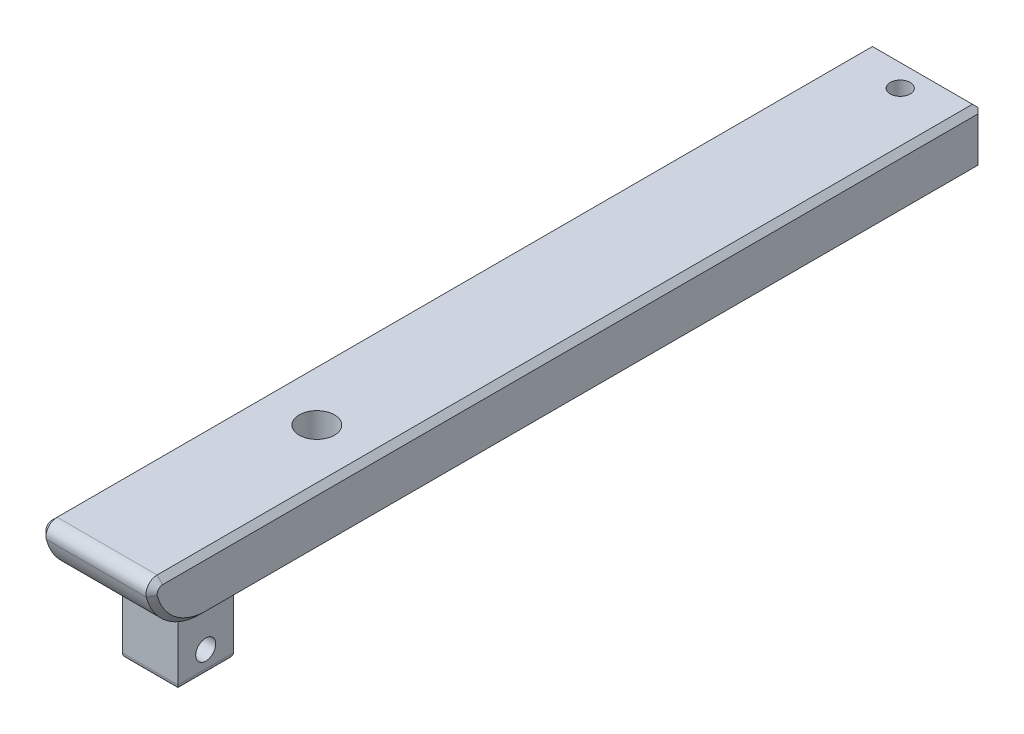
ISO-10303-21;
HEADER;
FILE_DESCRIPTION(('STEP AP214'),'2;1');
FILE_NAME('part.step','',(''),(''),'','','');
FILE_SCHEMA(('AUTOMOTIVE_DESIGN { 1 0 10303 214 1 1 1 1 }'));
ENDSEC;
DATA;
#1=APPLICATION_CONTEXT('core data for automotive mechanical design processes');
#2=APPLICATION_PROTOCOL_DEFINITION('international standard','automotive_design',2000,#1);
#3=PRODUCT_CONTEXT('',#1,'mechanical');
#4=PRODUCT('Part','Part','',(#3));
#5=PRODUCT_RELATED_PRODUCT_CATEGORY('part','',(#4));
#6=PRODUCT_DEFINITION_FORMATION('','',#4);
#7=PRODUCT_DEFINITION_CONTEXT('part definition',#1,'design');
#8=PRODUCT_DEFINITION('design','',#6,#7);
#9=PRODUCT_DEFINITION_SHAPE('','',#8);
#10=(LENGTH_UNIT() NAMED_UNIT(*) SI_UNIT(.MILLI.,.METRE.));
#11=(NAMED_UNIT(*) PLANE_ANGLE_UNIT() SI_UNIT($,.RADIAN.));
#12=(NAMED_UNIT(*) SI_UNIT($,.STERADIAN.) SOLID_ANGLE_UNIT());
#13=UNCERTAINTY_MEASURE_WITH_UNIT(LENGTH_MEASURE(1.E-05),#10,'distance_accuracy_value','');
#14=(GEOMETRIC_REPRESENTATION_CONTEXT(3) GLOBAL_UNCERTAINTY_ASSIGNED_CONTEXT((#13)) GLOBAL_UNIT_ASSIGNED_CONTEXT((#10,
#11,#12)) REPRESENTATION_CONTEXT('',''));
#15=CARTESIAN_POINT('',(0.,0.,0.));
#16=DIRECTION('',(0.,0.,1.));
#17=DIRECTION('',(1.,0.,0.));
#18=AXIS2_PLACEMENT_3D('',#15,#16,#17);
#19=CARTESIAN_POINT('',(0.,0.,0.));
#20=DIRECTION('',(0.,-1.,0.));
#21=DIRECTION('',(0.,0.,-1.));
#22=AXIS2_PLACEMENT_3D('',#19,#20,#21);
#23=PLANE('',#22);
#24=CARTESIAN_POINT('',(10.,0.,-40.));
#25=DIRECTION('',(0.,-1.,0.));
#26=DIRECTION('',(0.,0.,-1.));
#27=AXIS2_PLACEMENT_3D('',#24,#25,#26);
#28=CIRCLE('',#27,3.175);
#29=CARTESIAN_POINT('',(10.,0.,-43.175));
#30=VERTEX_POINT('',#29);
#31=EDGE_CURVE('E290',#30,#30,#28,.T.);
#32=ORIENTED_EDGE('',*,*,#31,.F.);
#33=EDGE_LOOP('',(#32));
#34=FACE_BOUND('',#33,.T.);
#35=CARTESIAN_POINT('',(10.,0.,-145.));
#36=DIRECTION('',(0.,-1.,0.));
#37=DIRECTION('',(0.,0.,-1.));
#38=AXIS2_PLACEMENT_3D('',#35,#36,#37);
#39=CIRCLE('',#38,1.8);
#40=CARTESIAN_POINT('',(10.,0.,-146.8));
#41=VERTEX_POINT('',#40);
#42=EDGE_CURVE('E188',#41,#41,#39,.T.);
#43=ORIENTED_EDGE('',*,*,#42,.F.);
#44=EDGE_LOOP('',(#43));
#45=FACE_BOUND('',#44,.T.);
#46=DIRECTION('',(0.,0.,-1.));
#47=VECTOR('',#46,1.);
#48=CARTESIAN_POINT('',(0.99999999999998,0.,-150.));
#49=LINE('',#48,#47);
#50=CARTESIAN_POINT('',(0.99999999999998,0.,-10.));
#51=VERTEX_POINT('',#50);
#52=CARTESIAN_POINT('',(0.99999999999998,0.,-149.));
#53=VERTEX_POINT('',#52);
#54=EDGE_CURVE('E246',#51,#53,#49,.T.);
#55=ORIENTED_EDGE('',*,*,#54,.T.);
#56=DIRECTION('',(1.,0.,0.));
#57=VECTOR('',#56,1.);
#58=CARTESIAN_POINT('',(19.,0.,-149.));
#59=LINE('',#58,#57);
#60=CARTESIAN_POINT('',(19.,0.,-149.));
#61=VERTEX_POINT('',#60);
#62=EDGE_CURVE('E48',#53,#61,#59,.T.);
#63=ORIENTED_EDGE('',*,*,#62,.T.);
#64=DIRECTION('',(0.,0.,1.));
#65=VECTOR('',#64,1.);
#66=CARTESIAN_POINT('',(19.,0.,-10.));
#67=LINE('',#66,#65);
#68=CARTESIAN_POINT('',(19.,0.,-10.));
#69=VERTEX_POINT('',#68);
#70=EDGE_CURVE('E248',#61,#69,#67,.T.);
#71=ORIENTED_EDGE('',*,*,#70,.T.);
#72=DIRECTION('',(1.,0.,0.));
#73=VECTOR('',#72,1.);
#74=CARTESIAN_POINT('',(0.,0.,-10.));
#75=LINE('',#74,#73);
#76=CARTESIAN_POINT('',(15.,0.,-10.));
#77=VERTEX_POINT('',#76);
#78=EDGE_CURVE('E221',#69,#77,#75,.F.);
#79=ORIENTED_EDGE('',*,*,#78,.T.);
#80=DIRECTION('',(0.,0.,1.));
#81=VECTOR('',#80,1.);
#82=CARTESIAN_POINT('',(15.,0.,-10.));
#83=LINE('',#82,#81);
#84=CARTESIAN_POINT('',(15.,0.,-20.));
#85=VERTEX_POINT('',#84);
#86=EDGE_CURVE('E203',#85,#77,#83,.T.);
#87=ORIENTED_EDGE('',*,*,#86,.F.);
#88=DIRECTION('',(1.,0.,0.));
#89=VECTOR('',#88,1.);
#90=CARTESIAN_POINT('',(5.,0.,-20.));
#91=LINE('',#90,#89);
#92=CARTESIAN_POINT('',(5.,0.,-20.));
#93=VERTEX_POINT('',#92);
#94=EDGE_CURVE('E183',#93,#85,#91,.T.);
#95=ORIENTED_EDGE('',*,*,#94,.F.);
#96=DIRECTION('',(0.,0.,-1.));
#97=VECTOR('',#96,1.);
#98=CARTESIAN_POINT('',(5.,0.,-10.));
#99=LINE('',#98,#97);
#100=CARTESIAN_POINT('',(5.,0.,-10.));
#101=VERTEX_POINT('',#100);
#102=EDGE_CURVE('E192',#101,#93,#99,.T.);
#103=ORIENTED_EDGE('',*,*,#102,.F.);
#104=DIRECTION('',(1.,0.,0.));
#105=VECTOR('',#104,1.);
#106=CARTESIAN_POINT('',(0.,0.,-10.));
#107=LINE('',#106,#105);
#108=EDGE_CURVE('E219',#101,#51,#107,.F.);
#109=ORIENTED_EDGE('',*,*,#108,.T.);
#110=EDGE_LOOP('',(#55,#63,#71,#79,#87,#95,#103,#109));
#111=FACE_BOUND('',#110,.T.);
#112=ADVANCED_FACE('F39',(#34,#45,#111),#23,.T.);
#113=CARTESIAN_POINT('',(0.,10.,0.));
#114=DIRECTION('',(1.,0.,0.));
#115=DIRECTION('',(0.,0.,-1.));
#116=AXIS2_PLACEMENT_3D('',#113,#114,#115);
#117=PLANE('',#116);
#118=DIRECTION('',(0.,-1.,0.));
#119=VECTOR('',#118,1.);
#120=CARTESIAN_POINT('',(0.,10.,-149.));
#121=LINE('',#120,#119);
#122=CARTESIAN_POINT('',(0.,9.00000000000001,-149.));
#123=VERTEX_POINT('',#122);
#124=CARTESIAN_POINT('',(0.,0.99999999999999,-149.));
#125=VERTEX_POINT('',#124);
#126=EDGE_CURVE('E269',#123,#125,#121,.T.);
#127=ORIENTED_EDGE('',*,*,#126,.T.);
#128=DIRECTION('',(0.,0.,1.));
#129=VECTOR('',#128,1.);
#130=CARTESIAN_POINT('',(0.,0.99999999999999,-10.));
#131=LINE('',#130,#129);
#132=CARTESIAN_POINT('',(0.,0.99999999999999,-10.));
#133=VERTEX_POINT('',#132);
#134=EDGE_CURVE('E271',#125,#133,#131,.T.);
#135=ORIENTED_EDGE('',*,*,#134,.T.);
#136=CARTESIAN_POINT('',(0.,10.,-10.));
#137=DIRECTION('',(1.,0.,0.));
#138=DIRECTION('',(0.,0.,-1.));
#139=AXIS2_PLACEMENT_3D('',#136,#137,#138);
#140=CIRCLE('',#139,9.00000000000001);
#141=CARTESIAN_POINT('',(0.,7.75,-1.2857874710333));
#142=VERTEX_POINT('',#141);
#143=EDGE_CURVE('E263',#133,#142,#140,.F.);
#144=ORIENTED_EDGE('',*,*,#143,.T.);
#145=CARTESIAN_POINT('',(0.,8.,-2.25403330758517));
#146=DIRECTION('',(1.,0.,0.));
#147=DIRECTION('',(0.,0.,-1.));
#148=AXIS2_PLACEMENT_3D('',#145,#146,#147);
#149=CIRCLE('',#148,1.00000000000001);
#150=CARTESIAN_POINT('',(0.,9.00000000000001,-2.25403330758517));
#151=VERTEX_POINT('',#150);
#152=EDGE_CURVE('E265',#142,#151,#149,.F.);
#153=ORIENTED_EDGE('',*,*,#152,.T.);
#154=DIRECTION('',(0.,0.,-1.));
#155=VECTOR('',#154,1.);
#156=CARTESIAN_POINT('',(0.,9.00000000000001,0.));
#157=LINE('',#156,#155);
#158=EDGE_CURVE('E267',#151,#123,#157,.T.);
#159=ORIENTED_EDGE('',*,*,#158,.T.);
#160=EDGE_LOOP('',(#127,#135,#144,#153,#159));
#161=FACE_BOUND('',#160,.T.);
#162=ADVANCED_FACE('F377',(#161),#117,.F.);
#163=CARTESIAN_POINT('',(20.,10.,0.));
#164=DIRECTION('',(-1.,0.,0.));
#165=DIRECTION('',(0.,0.,1.));
#166=AXIS2_PLACEMENT_3D('',#163,#164,#165);
#167=PLANE('',#166);
#168=DIRECTION('',(0.,0.,-1.));
#169=VECTOR('',#168,1.);
#170=CARTESIAN_POINT('',(20.,1.00000000000001,-150.));
#171=LINE('',#170,#169);
#172=CARTESIAN_POINT('',(20.,1.00000000000001,-10.));
#173=VERTEX_POINT('',#172);
#174=CARTESIAN_POINT('',(20.,1.00000000000001,-149.));
#175=VERTEX_POINT('',#174);
#176=EDGE_CURVE('E241',#173,#175,#171,.T.);
#177=ORIENTED_EDGE('',*,*,#176,.T.);
#178=DIRECTION('',(0.,1.,0.));
#179=VECTOR('',#178,1.);
#180=CARTESIAN_POINT('',(20.,10.,-149.));
#181=LINE('',#180,#179);
#182=CARTESIAN_POINT('',(20.,8.99999999999999,-149.));
#183=VERTEX_POINT('',#182);
#184=EDGE_CURVE('E243',#175,#183,#181,.T.);
#185=ORIENTED_EDGE('',*,*,#184,.T.);
#186=DIRECTION('',(0.,0.,1.));
#187=VECTOR('',#186,1.);
#188=CARTESIAN_POINT('',(20.,8.99999999999999,0.));
#189=LINE('',#188,#187);
#190=CARTESIAN_POINT('',(20.,8.99999999999999,-2.25403330758517));
#191=VERTEX_POINT('',#190);
#192=EDGE_CURVE('E235',#183,#191,#189,.T.);
#193=ORIENTED_EDGE('',*,*,#192,.T.);
#194=CARTESIAN_POINT('',(20.,8.,-2.25403330758517));
#195=DIRECTION('',(-1.,0.,0.));
#196=DIRECTION('',(0.,0.,1.));
#197=AXIS2_PLACEMENT_3D('',#194,#195,#196);
#198=CIRCLE('',#197,0.999999999999985);
#199=CARTESIAN_POINT('',(20.,7.75,-1.28578747103333));
#200=VERTEX_POINT('',#199);
#201=EDGE_CURVE('E237',#191,#200,#198,.F.);
#202=ORIENTED_EDGE('',*,*,#201,.T.);
#203=CARTESIAN_POINT('',(20.,10.,-10.));
#204=DIRECTION('',(-1.,0.,0.));
#205=DIRECTION('',(0.,0.,1.));
#206=AXIS2_PLACEMENT_3D('',#203,#204,#205);
#207=CIRCLE('',#206,8.99999999999999);
#208=EDGE_CURVE('E239',#200,#173,#207,.F.);
#209=ORIENTED_EDGE('',*,*,#208,.T.);
#210=EDGE_LOOP('',(#177,#185,#193,#202,#209));
#211=FACE_BOUND('',#210,.T.);
#212=ADVANCED_FACE('F405',(#211),#167,.F.);
#213=CARTESIAN_POINT('',(0.,10.,-150.));
#214=DIRECTION('',(0.,0.,1.));
#215=DIRECTION('',(1.,0.,0.));
#216=AXIS2_PLACEMENT_3D('',#213,#214,#215);
#217=PLANE('',#216);
#218=DIRECTION('',(0.,1.,0.));
#219=VECTOR('',#218,1.);
#220=CARTESIAN_POINT('',(0.99999999999998,10.,-150.));
#221=LINE('',#220,#219);
#222=CARTESIAN_POINT('',(0.99999999999998,0.999999999999987,-150.));
#223=VERTEX_POINT('',#222);
#224=CARTESIAN_POINT('',(0.99999999999998,9.00000000000003,-150.));
#225=VERTEX_POINT('',#224);
#226=EDGE_CURVE('E229',#223,#225,#221,.T.);
#227=ORIENTED_EDGE('',*,*,#226,.T.);
#228=DIRECTION('',(1.,0.,0.));
#229=VECTOR('',#228,1.);
#230=CARTESIAN_POINT('',(0.,9.00000000000003,-150.));
#231=LINE('',#230,#229);
#232=CARTESIAN_POINT('',(19.,9.00000000000003,-150.));
#233=VERTEX_POINT('',#232);
#234=EDGE_CURVE('E340',#225,#233,#231,.T.);
#235=ORIENTED_EDGE('',*,*,#234,.T.);
#236=DIRECTION('',(0.,-1.,0.));
#237=VECTOR('',#236,1.);
#238=CARTESIAN_POINT('',(19.,10.,-150.));
#239=LINE('',#238,#237);
#240=CARTESIAN_POINT('',(19.,0.999999999999987,-150.));
#241=VERTEX_POINT('',#240);
#242=EDGE_CURVE('E232',#233,#241,#239,.T.);
#243=ORIENTED_EDGE('',*,*,#242,.T.);
#244=DIRECTION('',(-1.,0.,0.));
#245=VECTOR('',#244,1.);
#246=CARTESIAN_POINT('',(0.99999999999998,0.999999999999987,-150.));
#247=LINE('',#246,#245);
#248=EDGE_CURVE('E337',#241,#223,#247,.T.);
#249=ORIENTED_EDGE('',*,*,#248,.T.);
#250=EDGE_LOOP('',(#227,#235,#243,#249));
#251=FACE_BOUND('',#250,.T.);
#252=ADVANCED_FACE('F435',(#251),#217,.F.);
#253=CARTESIAN_POINT('',(0.,10.,0.));
#254=DIRECTION('',(0.,-1.,0.));
#255=DIRECTION('',(0.,0.,-1.));
#256=AXIS2_PLACEMENT_3D('',#253,#254,#255);
#257=PLANE('',#256);
#258=CARTESIAN_POINT('',(10.,10.,-40.));
#259=DIRECTION('',(0.,-1.,0.));
#260=DIRECTION('',(0.,0.,-1.));
#261=AXIS2_PLACEMENT_3D('',#258,#259,#260);
#262=CIRCLE('',#261,3.175);
#263=CARTESIAN_POINT('',(10.,10.,-43.175));
#264=VERTEX_POINT('',#263);
#265=EDGE_CURVE('E709',#264,#264,#262,.T.);
#266=ORIENTED_EDGE('',*,*,#265,.T.);
#267=EDGE_LOOP('',(#266));
#268=FACE_BOUND('',#267,.T.);
#269=CARTESIAN_POINT('',(10.,10.,-145.));
#270=DIRECTION('',(0.,-1.,0.));
#271=DIRECTION('',(0.,0.,-1.));
#272=AXIS2_PLACEMENT_3D('',#269,#270,#271);
#273=CIRCLE('',#272,1.8);
#274=CARTESIAN_POINT('',(10.,10.,-146.8));
#275=VERTEX_POINT('',#274);
#276=EDGE_CURVE('E216',#275,#275,#273,.T.);
#277=ORIENTED_EDGE('',*,*,#276,.T.);
#278=EDGE_LOOP('',(#277));
#279=FACE_BOUND('',#278,.T.);
#280=DIRECTION('',(0.,0.,-1.));
#281=VECTOR('',#280,1.);
#282=CARTESIAN_POINT('',(19.,10.,0.));
#283=LINE('',#282,#281);
#284=CARTESIAN_POINT('',(19.,10.,-2.25403330758517));
#285=VERTEX_POINT('',#284);
#286=CARTESIAN_POINT('',(19.,10.,-149.));
#287=VERTEX_POINT('',#286);
#288=EDGE_CURVE('E260',#285,#287,#283,.T.);
#289=ORIENTED_EDGE('',*,*,#288,.T.);
#290=DIRECTION('',(-1.,0.,0.));
#291=VECTOR('',#290,1.);
#292=CARTESIAN_POINT('',(0.,10.,-149.));
#293=LINE('',#292,#291);
#294=CARTESIAN_POINT('',(0.99999999999998,10.,-149.));
#295=VERTEX_POINT('',#294);
#296=EDGE_CURVE('E319',#287,#295,#293,.T.);
#297=ORIENTED_EDGE('',*,*,#296,.T.);
#298=DIRECTION('',(0.,0.,1.));
#299=VECTOR('',#298,1.);
#300=CARTESIAN_POINT('',(0.99999999999998,10.,0.));
#301=LINE('',#300,#299);
#302=CARTESIAN_POINT('',(0.99999999999998,10.,-2.25403330758517));
#303=VERTEX_POINT('',#302);
#304=EDGE_CURVE('E258',#295,#303,#301,.T.);
#305=ORIENTED_EDGE('',*,*,#304,.T.);
#306=DIRECTION('',(1.,0.,0.));
#307=VECTOR('',#306,1.);
#308=CARTESIAN_POINT('',(20.,10.,-2.25403330758517));
#309=LINE('',#308,#307);
#310=EDGE_CURVE('E223',#303,#285,#309,.T.);
#311=ORIENTED_EDGE('',*,*,#310,.T.);
#312=EDGE_LOOP('',(#289,#297,#305,#311));
#313=FACE_BOUND('',#312,.T.);
#314=ADVANCED_FACE('F358',(#268,#279,#313),#257,.F.);
#315=CARTESIAN_POINT('',(10.,0.,-145.));
#316=DIRECTION('',(0.,-1.,0.));
#317=DIRECTION('',(0.,0.,-1.));
#318=AXIS2_PLACEMENT_3D('',#315,#316,#317);
#319=CYLINDRICAL_SURFACE('',#318,1.8);
#320=ORIENTED_EDGE('',*,*,#276,.F.);
#321=EDGE_LOOP('',(#320));
#322=FACE_BOUND('',#321,.T.);
#323=ORIENTED_EDGE('',*,*,#42,.T.);
#324=EDGE_LOOP('',(#323));
#325=FACE_BOUND('',#324,.T.);
#326=ADVANCED_FACE('F660',(#322,#325),#319,.F.);
#327=CARTESIAN_POINT('',(5.,-14.,-10.));
#328=DIRECTION('',(1.,0.,0.));
#329=DIRECTION('',(0.,0.,-1.));
#330=AXIS2_PLACEMENT_3D('',#327,#328,#329);
#331=PLANE('',#330);
#332=CARTESIAN_POINT('',(5.,-10.,-15.));
#333=DIRECTION('',(-1.,0.,0.));
#334=DIRECTION('',(0.,0.,1.));
#335=AXIS2_PLACEMENT_3D('',#332,#333,#334);
#336=CIRCLE('',#335,1.79999999999999);
#337=CARTESIAN_POINT('',(5.,-10.,-13.2));
#338=VERTEX_POINT('',#337);
#339=EDGE_CURVE('E713',#338,#338,#336,.T.);
#340=ORIENTED_EDGE('',*,*,#339,.F.);
#341=EDGE_LOOP('',(#340));
#342=FACE_BOUND('',#341,.T.);
#343=DIRECTION('',(0.,1.,0.));
#344=VECTOR('',#343,1.);
#345=CARTESIAN_POINT('',(5.,-14.,-20.));
#346=LINE('',#345,#344);
#347=CARTESIAN_POINT('',(5.,-13.,-20.));
#348=VERTEX_POINT('',#347);
#349=EDGE_CURVE('E178',#348,#93,#346,.T.);
#350=ORIENTED_EDGE('',*,*,#349,.F.);
#351=DIRECTION('',(0.,0.,-1.));
#352=VECTOR('',#351,1.);
#353=CARTESIAN_POINT('',(5.,-13.,-10.));
#354=LINE('',#353,#352);
#355=CARTESIAN_POINT('',(5.,-13.,-10.));
#356=VERTEX_POINT('',#355);
#357=EDGE_CURVE('E313',#348,#356,#354,.F.);
#358=ORIENTED_EDGE('',*,*,#357,.T.);
#359=DIRECTION('',(0.,1.,0.));
#360=VECTOR('',#359,1.);
#361=CARTESIAN_POINT('',(5.,-14.,-10.));
#362=LINE('',#361,#360);
#363=EDGE_CURVE('E195',#356,#101,#362,.T.);
#364=ORIENTED_EDGE('',*,*,#363,.T.);
#365=ORIENTED_EDGE('',*,*,#102,.T.);
#366=EDGE_LOOP('',(#350,#358,#364,#365));
#367=FACE_BOUND('',#366,.T.);
#368=ADVANCED_FACE('F193',(#342,#367),#331,.F.);
#369=CARTESIAN_POINT('',(5.,-14.,-20.));
#370=DIRECTION('',(0.,0.,1.));
#371=DIRECTION('',(1.,0.,0.));
#372=AXIS2_PLACEMENT_3D('',#369,#370,#371);
#373=PLANE('',#372);
#374=DIRECTION('',(0.,1.,0.));
#375=VECTOR('',#374,1.);
#376=CARTESIAN_POINT('',(15.,-14.,-20.));
#377=LINE('',#376,#375);
#378=CARTESIAN_POINT('',(15.,-13.,-20.));
#379=VERTEX_POINT('',#378);
#380=EDGE_CURVE('E189',#379,#85,#377,.T.);
#381=ORIENTED_EDGE('',*,*,#380,.F.);
#382=DIRECTION('',(1.,0.,0.));
#383=VECTOR('',#382,1.);
#384=CARTESIAN_POINT('',(5.,-13.,-20.));
#385=LINE('',#384,#383);
#386=EDGE_CURVE('E186',#379,#348,#385,.F.);
#387=ORIENTED_EDGE('',*,*,#386,.T.);
#388=ORIENTED_EDGE('',*,*,#349,.T.);
#389=ORIENTED_EDGE('',*,*,#94,.T.);
#390=EDGE_LOOP('',(#381,#387,#388,#389));
#391=FACE_BOUND('',#390,.T.);
#392=ADVANCED_FACE('F181',(#391),#373,.F.);
#393=CARTESIAN_POINT('',(15.,-14.,-10.));
#394=DIRECTION('',(-1.,0.,0.));
#395=DIRECTION('',(0.,0.,1.));
#396=AXIS2_PLACEMENT_3D('',#393,#394,#395);
#397=PLANE('',#396);
#398=CARTESIAN_POINT('',(15.,-10.,-15.));
#399=DIRECTION('',(-1.,0.,0.));
#400=DIRECTION('',(0.,0.,1.));
#401=AXIS2_PLACEMENT_3D('',#398,#399,#400);
#402=CIRCLE('',#401,1.79999999999999);
#403=CARTESIAN_POINT('',(15.,-10.,-13.2));
#404=VERTEX_POINT('',#403);
#405=EDGE_CURVE('E199',#404,#404,#402,.T.);
#406=ORIENTED_EDGE('',*,*,#405,.T.);
#407=EDGE_LOOP('',(#406));
#408=FACE_BOUND('',#407,.T.);
#409=DIRECTION('',(0.,1.,0.));
#410=VECTOR('',#409,1.);
#411=CARTESIAN_POINT('',(15.,-14.,-10.));
#412=LINE('',#411,#410);
#413=CARTESIAN_POINT('',(15.,-13.,-10.));
#414=VERTEX_POINT('',#413);
#415=EDGE_CURVE('E211',#414,#77,#412,.T.);
#416=ORIENTED_EDGE('',*,*,#415,.F.);
#417=DIRECTION('',(0.,0.,1.));
#418=VECTOR('',#417,1.);
#419=CARTESIAN_POINT('',(15.,-13.,-20.));
#420=LINE('',#419,#418);
#421=EDGE_CURVE('E317',#414,#379,#420,.F.);
#422=ORIENTED_EDGE('',*,*,#421,.T.);
#423=ORIENTED_EDGE('',*,*,#380,.T.);
#424=ORIENTED_EDGE('',*,*,#86,.T.);
#425=EDGE_LOOP('',(#416,#422,#423,#424));
#426=FACE_BOUND('',#425,.T.);
#427=ADVANCED_FACE('F637',(#408,#426),#397,.F.);
#428=CARTESIAN_POINT('',(5.,-14.,-10.));
#429=DIRECTION('',(0.,0.,-1.));
#430=DIRECTION('',(-1.,0.,0.));
#431=AXIS2_PLACEMENT_3D('',#428,#429,#430);
#432=PLANE('',#431);
#433=ORIENTED_EDGE('',*,*,#363,.F.);
#434=DIRECTION('',(-1.,0.,0.));
#435=VECTOR('',#434,1.);
#436=CARTESIAN_POINT('',(15.,-13.,-10.));
#437=LINE('',#436,#435);
#438=EDGE_CURVE('E315',#356,#414,#437,.F.);
#439=ORIENTED_EDGE('',*,*,#438,.T.);
#440=ORIENTED_EDGE('',*,*,#415,.T.);
#441=DIRECTION('',(-1.,0.,0.));
#442=VECTOR('',#441,1.);
#443=CARTESIAN_POINT('',(5.,0.,-10.));
#444=LINE('',#443,#442);
#445=EDGE_CURVE('E205',#77,#101,#444,.T.);
#446=ORIENTED_EDGE('',*,*,#445,.T.);
#447=EDGE_LOOP('',(#433,#439,#440,#446));
#448=FACE_BOUND('',#447,.T.);
#449=ADVANCED_FACE('F628',(#448),#432,.F.);
#450=CARTESIAN_POINT('',(0.,-14.,0.));
#451=DIRECTION('',(0.,-1.,0.));
#452=DIRECTION('',(0.,0.,-1.));
#453=AXIS2_PLACEMENT_3D('',#450,#451,#452);
#454=PLANE('',#453);
#455=DIRECTION('',(0.,0.,-1.));
#456=VECTOR('',#455,1.);
#457=CARTESIAN_POINT('',(6.,-14.,-20.));
#458=LINE('',#457,#456);
#459=CARTESIAN_POINT('',(6.,-14.,-11.));
#460=VERTEX_POINT('',#459);
#461=CARTESIAN_POINT('',(6.,-14.,-19.));
#462=VERTEX_POINT('',#461);
#463=EDGE_CURVE('E307',#460,#462,#458,.T.);
#464=ORIENTED_EDGE('',*,*,#463,.T.);
#465=DIRECTION('',(1.,0.,0.));
#466=VECTOR('',#465,1.);
#467=CARTESIAN_POINT('',(15.,-14.,-19.));
#468=LINE('',#467,#466);
#469=CARTESIAN_POINT('',(14.,-14.,-19.));
#470=VERTEX_POINT('',#469);
#471=EDGE_CURVE('E309',#462,#470,#468,.T.);
#472=ORIENTED_EDGE('',*,*,#471,.T.);
#473=DIRECTION('',(0.,0.,1.));
#474=VECTOR('',#473,1.);
#475=CARTESIAN_POINT('',(14.,-14.,-10.));
#476=LINE('',#475,#474);
#477=CARTESIAN_POINT('',(14.,-14.,-11.));
#478=VERTEX_POINT('',#477);
#479=EDGE_CURVE('E274',#470,#478,#476,.T.);
#480=ORIENTED_EDGE('',*,*,#479,.T.);
#481=DIRECTION('',(-1.,0.,0.));
#482=VECTOR('',#481,1.);
#483=CARTESIAN_POINT('',(5.,-14.,-11.));
#484=LINE('',#483,#482);
#485=EDGE_CURVE('E305',#478,#460,#484,.T.);
#486=ORIENTED_EDGE('',*,*,#485,.T.);
#487=EDGE_LOOP('',(#464,#472,#480,#486));
#488=FACE_BOUND('',#487,.T.);
#489=ADVANCED_FACE('F619',(#488),#454,.T.);
#490=CARTESIAN_POINT('',(5.,-10.,-15.));
#491=DIRECTION('',(-1.,0.,0.));
#492=DIRECTION('',(0.,0.,1.));
#493=AXIS2_PLACEMENT_3D('',#490,#491,#492);
#494=CYLINDRICAL_SURFACE('',#493,1.79999999999999);
#495=ORIENTED_EDGE('',*,*,#339,.T.);
#496=EDGE_LOOP('',(#495));
#497=FACE_BOUND('',#496,.T.);
#498=ORIENTED_EDGE('',*,*,#405,.F.);
#499=EDGE_LOOP('',(#498));
#500=FACE_BOUND('',#499,.T.);
#501=ADVANCED_FACE('F609',(#497,#500),#494,.F.);
#502=CARTESIAN_POINT('',(10.,0.,-40.));
#503=DIRECTION('',(0.,-1.,0.));
#504=DIRECTION('',(0.,0.,-1.));
#505=AXIS2_PLACEMENT_3D('',#502,#503,#504);
#506=CYLINDRICAL_SURFACE('',#505,3.175);
#507=ORIENTED_EDGE('',*,*,#265,.F.);
#508=EDGE_LOOP('',(#507));
#509=FACE_BOUND('',#508,.T.);
#510=ORIENTED_EDGE('',*,*,#31,.T.);
#511=EDGE_LOOP('',(#510));
#512=FACE_BOUND('',#511,.T.);
#513=ADVANCED_FACE('F442',(#509,#512),#506,.F.);
#514=CARTESIAN_POINT('',(0.,10.,-10.));
#515=DIRECTION('',(-1.,0.,0.));
#516=DIRECTION('',(0.,0.,1.));
#517=AXIS2_PLACEMENT_3D('',#514,#515,#516);
#518=CYLINDRICAL_SURFACE('',#517,10.);
#519=ORIENTED_EDGE('',*,*,#78,.F.);
#520=CARTESIAN_POINT('',(19.,10.,-10.));
#521=DIRECTION('',(-1.,0.,0.));
#522=DIRECTION('',(0.,0.,1.));
#523=AXIS2_PLACEMENT_3D('',#520,#521,#522);
#524=CIRCLE('',#523,10.);
#525=CARTESIAN_POINT('',(19.,7.5,-0.317541634481458));
#526=VERTEX_POINT('',#525);
#527=EDGE_CURVE('E252',#69,#526,#524,.T.);
#528=ORIENTED_EDGE('',*,*,#527,.T.);
#529=DIRECTION('',(-1.,0.,0.));
#530=VECTOR('',#529,1.);
#531=CARTESIAN_POINT('',(0.,7.5,-0.317541634481458));
#532=LINE('',#531,#530);
#533=CARTESIAN_POINT('',(0.99999999999998,7.5,-0.317541634481458));
#534=VERTEX_POINT('',#533);
#535=EDGE_CURVE('E226',#526,#534,#532,.T.);
#536=ORIENTED_EDGE('',*,*,#535,.T.);
#537=CARTESIAN_POINT('',(0.99999999999998,10.,-10.));
#538=DIRECTION('',(1.,0.,0.));
#539=DIRECTION('',(0.,0.,-1.));
#540=AXIS2_PLACEMENT_3D('',#537,#538,#539);
#541=CIRCLE('',#540,10.);
#542=EDGE_CURVE('E250',#534,#51,#541,.T.);
#543=ORIENTED_EDGE('',*,*,#542,.T.);
#544=ORIENTED_EDGE('',*,*,#108,.F.);
#545=ORIENTED_EDGE('',*,*,#445,.F.);
#546=EDGE_LOOP('',(#519,#528,#536,#543,#544,#545));
#547=FACE_BOUND('',#546,.T.);
#548=ADVANCED_FACE('F390',(#547),#518,.T.);
#549=CARTESIAN_POINT('',(0.,8.,-2.25403330758517));
#550=DIRECTION('',(-1.,0.,0.));
#551=DIRECTION('',(0.,0.,1.));
#552=AXIS2_PLACEMENT_3D('',#549,#550,#551);
#553=CYLINDRICAL_SURFACE('',#552,2.);
#554=ORIENTED_EDGE('',*,*,#535,.F.);
#555=CARTESIAN_POINT('',(19.,8.,-2.25403330758517));
#556=DIRECTION('',(-1.,0.,0.));
#557=DIRECTION('',(0.,0.,1.));
#558=AXIS2_PLACEMENT_3D('',#555,#556,#557);
#559=CIRCLE('',#558,2.);
#560=EDGE_CURVE('E256',#526,#285,#559,.T.);
#561=ORIENTED_EDGE('',*,*,#560,.T.);
#562=ORIENTED_EDGE('',*,*,#310,.F.);
#563=CARTESIAN_POINT('',(0.99999999999998,8.,-2.25403330758517));
#564=DIRECTION('',(1.,0.,0.));
#565=DIRECTION('',(0.,0.,-1.));
#566=AXIS2_PLACEMENT_3D('',#563,#564,#565);
#567=CIRCLE('',#566,2.);
#568=EDGE_CURVE('E254',#303,#534,#567,.T.);
#569=ORIENTED_EDGE('',*,*,#568,.T.);
#570=EDGE_LOOP('',(#554,#561,#562,#569));
#571=FACE_BOUND('',#570,.T.);
#572=ADVANCED_FACE('F386',(#571),#553,.T.);
#573=CARTESIAN_POINT('',(20.,8.,-2.25403330758517));
#574=DIRECTION('',(-1.,0.,0.));
#575=DIRECTION('',(0.,0.,1.));
#576=AXIS2_PLACEMENT_3D('',#573,#574,#575);
#577=CONICAL_SURFACE('',#576,0.999999999999985,0.785398163397448);
#578=DIRECTION('',(0.707106781186547,-0.707106781186547,0.));
#579=VECTOR('',#578,1.);
#580=CARTESIAN_POINT('',(19.,10.,-2.25403330758517));
#581=LINE('',#580,#579);
#582=EDGE_CURVE('E284',#285,#191,#581,.T.);
#583=ORIENTED_EDGE('',*,*,#582,.F.);
#584=ORIENTED_EDGE('',*,*,#560,.F.);
#585=DIRECTION('',(-0.707106781186547,-0.176776695296637,0.684653196881458));
#586=VECTOR('',#585,1.);
#587=CARTESIAN_POINT('',(20.,7.75,-1.28578747103333));
#588=LINE('',#587,#586);
#589=EDGE_CURVE('E287',#200,#526,#588,.T.);
#590=ORIENTED_EDGE('',*,*,#589,.F.);
#591=ORIENTED_EDGE('',*,*,#201,.F.);
#592=EDGE_LOOP('',(#583,#584,#590,#591));
#593=FACE_BOUND('',#592,.T.);
#594=ADVANCED_FACE('F412',(#593),#577,.T.);
#595=CARTESIAN_POINT('',(20.,10.,-10.));
#596=DIRECTION('',(-1.,0.,0.));
#597=DIRECTION('',(0.,0.,1.));
#598=AXIS2_PLACEMENT_3D('',#595,#596,#597);
#599=CONICAL_SURFACE('',#598,8.99999999999999,0.785398163397448);
#600=ORIENTED_EDGE('',*,*,#589,.T.);
#601=ORIENTED_EDGE('',*,*,#527,.F.);
#602=DIRECTION('',(-0.707106781186547,-0.707106781186547,0.));
#603=VECTOR('',#602,1.);
#604=CARTESIAN_POINT('',(20.,1.00000000000001,-10.));
#605=LINE('',#604,#603);
#606=EDGE_CURVE('E281',#173,#69,#605,.T.);
#607=ORIENTED_EDGE('',*,*,#606,.F.);
#608=ORIENTED_EDGE('',*,*,#208,.F.);
#609=EDGE_LOOP('',(#600,#601,#607,#608));
#610=FACE_BOUND('',#609,.T.);
#611=ADVANCED_FACE('F395',(#610),#599,.T.);
#612=CARTESIAN_POINT('',(19.,10.,0.));
#613=DIRECTION('',(-0.707106781186547,-0.707106781186547,0.));
#614=DIRECTION('',(0.,0.,-1.));
#615=AXIS2_PLACEMENT_3D('',#612,#613,#614);
#616=PLANE('',#615);
#617=DIRECTION('',(-0.577350269189623,0.577350269189623,-0.577350269189631));
#618=VECTOR('',#617,1.);
#619=CARTESIAN_POINT('',(69.0000000000002,-40.0000000000002,-99.9999999999991));
#620=LINE('',#619,#618);
#621=CARTESIAN_POINT('',(19.5,9.50000000000001,-149.5));
#622=VERTEX_POINT('',#621);
#623=EDGE_CURVE('E278',#622,#183,#620,.F.);
#624=ORIENTED_EDGE('',*,*,#623,.F.);
#625=DIRECTION('',(-0.577350269189626,0.577350269189626,0.577350269189626));
#626=VECTOR('',#625,1.);
#627=CARTESIAN_POINT('',(-30.6666666666667,59.6666666666667,-99.3333333333333));
#628=LINE('',#627,#626);
#629=EDGE_CURVE('E346',#622,#287,#628,.T.);
#630=ORIENTED_EDGE('',*,*,#629,.T.);
#631=ORIENTED_EDGE('',*,*,#288,.F.);
#632=ORIENTED_EDGE('',*,*,#582,.T.);
#633=ORIENTED_EDGE('',*,*,#192,.F.);
#634=EDGE_LOOP('',(#624,#630,#631,#632,#633));
#635=FACE_BOUND('',#634,.T.);
#636=ADVANCED_FACE('F352',(#635),#616,.F.);
#637=CARTESIAN_POINT('',(20.,1.00000000000001,0.));
#638=DIRECTION('',(0.707106781186547,-0.707106781186547,0.));
#639=DIRECTION('',(0.,0.,1.));
#640=AXIS2_PLACEMENT_3D('',#637,#638,#639);
#641=PLANE('',#640);
#642=ORIENTED_EDGE('',*,*,#70,.F.);
#643=DIRECTION('',(0.577350269189629,0.577350269189629,-0.577350269189621));
#644=VECTOR('',#643,1.);
#645=CARTESIAN_POINT('',(-29.9999999999998,-48.9999999999998,-100.000000000001));
#646=LINE('',#645,#644);
#647=CARTESIAN_POINT('',(19.5,0.500000000000007,-149.5));
#648=VERTEX_POINT('',#647);
#649=EDGE_CURVE('E11',#61,#648,#646,.T.);
#650=ORIENTED_EDGE('',*,*,#649,.T.);
#651=DIRECTION('',(-0.577350269189623,-0.577350269189623,-0.577350269189631));
#652=VECTOR('',#651,1.);
#653=CARTESIAN_POINT('',(69.6666666666669,50.6666666666669,-99.3333333333324));
#654=LINE('',#653,#652);
#655=EDGE_CURVE('E275',#175,#648,#654,.T.);
#656=ORIENTED_EDGE('',*,*,#655,.F.);
#657=ORIENTED_EDGE('',*,*,#176,.F.);
#658=ORIENTED_EDGE('',*,*,#606,.T.);
#659=EDGE_LOOP('',(#642,#650,#656,#657,#658));
#660=FACE_BOUND('',#659,.T.);
#661=ADVANCED_FACE('F400',(#660),#641,.T.);
#662=CARTESIAN_POINT('',(19.,10.,-150.));
#663=DIRECTION('',(-0.707106781186552,0.,0.707106781186543));
#664=DIRECTION('',(0.,-1.,0.));
#665=AXIS2_PLACEMENT_3D('',#662,#663,#664);
#666=PLANE('',#665);
#667=ORIENTED_EDGE('',*,*,#242,.F.);
#668=DIRECTION('',(0.577350269189621,0.577350269189629,0.577350269189629));
#669=VECTOR('',#668,1.);
#670=CARTESIAN_POINT('',(19.3333333333333,9.33333333333336,-149.666666666667));
#671=LINE('',#670,#669);
#672=EDGE_CURVE('E344',#233,#622,#671,.T.);
#673=ORIENTED_EDGE('',*,*,#672,.T.);
#674=ORIENTED_EDGE('',*,*,#623,.T.);
#675=ORIENTED_EDGE('',*,*,#184,.F.);
#676=ORIENTED_EDGE('',*,*,#655,.T.);
#677=DIRECTION('',(0.577350269189618,-0.577350269189634,0.577350269189626));
#678=VECTOR('',#677,1.);
#679=CARTESIAN_POINT('',(16.,4.00000000000007,-153.));
#680=LINE('',#679,#678);
#681=EDGE_CURVE('E342',#648,#241,#680,.F.);
#682=ORIENTED_EDGE('',*,*,#681,.T.);
#683=EDGE_LOOP('',(#667,#673,#674,#675,#676,#682));
#684=FACE_BOUND('',#683,.T.);
#685=ADVANCED_FACE('F408',(#684),#666,.F.);
#686=CARTESIAN_POINT('',(0.99999999999998,10.,0.));
#687=DIRECTION('',(0.707106781186551,-0.707106781186544,0.));
#688=DIRECTION('',(0.,0.,1.));
#689=AXIS2_PLACEMENT_3D('',#686,#687,#688);
#690=PLANE('',#689);
#691=ORIENTED_EDGE('',*,*,#304,.F.);
#692=DIRECTION('',(-0.577350269189622,-0.577350269189628,-0.577350269189628));
#693=VECTOR('',#692,1.);
#694=CARTESIAN_POINT('',(50.6666666666665,59.666666666667,-99.333333333333));
#695=LINE('',#694,#693);
#696=CARTESIAN_POINT('',(0.500000000000007,9.50000000000002,-149.5));
#697=VERTEX_POINT('',#696);
#698=EDGE_CURVE('E331',#295,#697,#695,.T.);
#699=ORIENTED_EDGE('',*,*,#698,.T.);
#700=DIRECTION('',(-0.57735026918962,-0.577350269189626,0.577350269189632));
#701=VECTOR('',#700,1.);
#702=CARTESIAN_POINT('',(-49.,-40.0000000000005,-99.999999999999));
#703=LINE('',#702,#701);
#704=EDGE_CURVE('E299',#123,#697,#703,.F.);
#705=ORIENTED_EDGE('',*,*,#704,.F.);
#706=ORIENTED_EDGE('',*,*,#158,.F.);
#707=DIRECTION('',(-0.707106781186544,-0.707106781186551,0.));
#708=VECTOR('',#707,1.);
#709=CARTESIAN_POINT('',(0.99999999999998,10.,-2.25403330758517));
#710=LINE('',#709,#708);
#711=EDGE_CURVE('E279',#303,#151,#710,.T.);
#712=ORIENTED_EDGE('',*,*,#711,.F.);
#713=EDGE_LOOP('',(#691,#699,#705,#706,#712));
#714=FACE_BOUND('',#713,.T.);
#715=ADVANCED_FACE('F367',(#714),#690,.F.);
#716=CARTESIAN_POINT('',(0.,8.,-2.25403330758517));
#717=DIRECTION('',(1.,0.,0.));
#718=DIRECTION('',(0.,0.,-1.));
#719=AXIS2_PLACEMENT_3D('',#716,#717,#718);
#720=CONICAL_SURFACE('',#719,1.00000000000001,0.785398163397454);
#721=ORIENTED_EDGE('',*,*,#711,.T.);
#722=ORIENTED_EDGE('',*,*,#152,.F.);
#723=DIRECTION('',(-0.707106781186544,0.176776695296638,-0.684653196881461));
#724=VECTOR('',#723,1.);
#725=CARTESIAN_POINT('',(0.99999999999998,7.5,-0.317541634481458));
#726=LINE('',#725,#724);
#727=EDGE_CURVE('E296',#534,#142,#726,.T.);
#728=ORIENTED_EDGE('',*,*,#727,.F.);
#729=ORIENTED_EDGE('',*,*,#568,.F.);
#730=EDGE_LOOP('',(#721,#722,#728,#729));
#731=FACE_BOUND('',#730,.T.);
#732=ADVANCED_FACE('F381',(#731),#720,.T.);
#733=CARTESIAN_POINT('',(0.,10.,-149.));
#734=DIRECTION('',(0.707106781186555,0.,0.70710678118654));
#735=DIRECTION('',(0.,-1.,0.));
#736=AXIS2_PLACEMENT_3D('',#733,#734,#735);
#737=PLANE('',#736);
#738=ORIENTED_EDGE('',*,*,#704,.T.);
#739=DIRECTION('',(0.577350269189618,-0.57735026918963,-0.57735026918963));
#740=VECTOR('',#739,1.);
#741=CARTESIAN_POINT('',(0.,10.,-149.));
#742=LINE('',#741,#740);
#743=EDGE_CURVE('E335',#697,#225,#742,.T.);
#744=ORIENTED_EDGE('',*,*,#743,.T.);
#745=ORIENTED_EDGE('',*,*,#226,.F.);
#746=DIRECTION('',(0.577350269189615,0.577350269189635,-0.577350269189627));
#747=VECTOR('',#746,1.);
#748=CARTESIAN_POINT('',(3.33333333333333,3.33333333333342,-152.333333333333));
#749=LINE('',#748,#747);
#750=CARTESIAN_POINT('',(0.499999999999994,0.499999999999992,-149.5));
#751=VERTEX_POINT('',#750);
#752=EDGE_CURVE('E333',#223,#751,#749,.F.);
#753=ORIENTED_EDGE('',*,*,#752,.T.);
#754=DIRECTION('',(0.57735026918962,-0.577350269189626,-0.577350269189632));
#755=VECTOR('',#754,1.);
#756=CARTESIAN_POINT('',(-2.99999999999997,3.99999999999999,-146.));
#757=LINE('',#756,#755);
#758=EDGE_CURVE('E293',#125,#751,#757,.T.);
#759=ORIENTED_EDGE('',*,*,#758,.F.);
#760=ORIENTED_EDGE('',*,*,#126,.F.);
#761=EDGE_LOOP('',(#738,#744,#745,#753,#759,#760));
#762=FACE_BOUND('',#761,.T.);
#763=ADVANCED_FACE('F372',(#762),#737,.F.);
#764=CARTESIAN_POINT('',(0.,10.,-10.));
#765=DIRECTION('',(1.,0.,0.));
#766=DIRECTION('',(0.,0.,-1.));
#767=AXIS2_PLACEMENT_3D('',#764,#765,#766);
#768=CONICAL_SURFACE('',#767,9.00000000000001,0.785398163397454);
#769=ORIENTED_EDGE('',*,*,#727,.T.);
#770=ORIENTED_EDGE('',*,*,#143,.F.);
#771=DIRECTION('',(-0.707106781186544,0.707106781186551,0.));
#772=VECTOR('',#771,1.);
#773=CARTESIAN_POINT('',(0.99999999999998,0.,-10.));
#774=LINE('',#773,#772);
#775=EDGE_CURVE('E291',#51,#133,#774,.T.);
#776=ORIENTED_EDGE('',*,*,#775,.F.);
#777=ORIENTED_EDGE('',*,*,#542,.F.);
#778=EDGE_LOOP('',(#769,#770,#776,#777));
#779=FACE_BOUND('',#778,.T.);
#780=ADVANCED_FACE('F496',(#779),#768,.T.);
#781=CARTESIAN_POINT('',(0.,0.99999999999999,0.));
#782=DIRECTION('',(-0.707106781186551,-0.707106781186544,0.));
#783=DIRECTION('',(0.,0.,-1.));
#784=AXIS2_PLACEMENT_3D('',#781,#782,#783);
#785=PLANE('',#784);
#786=ORIENTED_EDGE('',*,*,#758,.T.);
#787=DIRECTION('',(0.577350269189624,-0.57735026918963,0.577350269189622));
#788=VECTOR('',#787,1.);
#789=CARTESIAN_POINT('',(49.9999999999996,-49.0000000000001,-100.000000000001));
#790=LINE('',#789,#788);
#791=EDGE_CURVE('E62',#751,#53,#790,.T.);
#792=ORIENTED_EDGE('',*,*,#791,.T.);
#793=ORIENTED_EDGE('',*,*,#54,.F.);
#794=ORIENTED_EDGE('',*,*,#775,.T.);
#795=ORIENTED_EDGE('',*,*,#134,.F.);
#796=EDGE_LOOP('',(#786,#792,#793,#794,#795));
#797=FACE_BOUND('',#796,.T.);
#798=ADVANCED_FACE('F503',(#797),#785,.T.);
#799=CARTESIAN_POINT('',(0.,-13.,-11.));
#800=DIRECTION('',(1.,0.,0.));
#801=DIRECTION('',(0.,0.,-1.));
#802=AXIS2_PLACEMENT_3D('',#799,#800,#801);
#803=CYLINDRICAL_SURFACE('',#802,1.);
#804=CARTESIAN_POINT('',(14.,-13.,-11.));
#805=DIRECTION('',(0.707106781186548,0.,-0.707106781186547));
#806=DIRECTION('',(-0.707106781186547,0.,-0.707106781186548));
#807=AXIS2_PLACEMENT_3D('',#804,#805,#806);
#808=ELLIPSE('',#807,1.41421356237309,1.);
#809=EDGE_CURVE('E324',#414,#478,#808,.T.);
#810=ORIENTED_EDGE('',*,*,#809,.F.);
#811=ORIENTED_EDGE('',*,*,#438,.F.);
#812=CARTESIAN_POINT('',(6.,-13.,-11.));
#813=DIRECTION('',(0.707106781186547,0.,0.707106781186548));
#814=DIRECTION('',(0.707106781186547,0.,-0.707106781186547));
#815=AXIS2_PLACEMENT_3D('',#812,#813,#814);
#816=ELLIPSE('',#815,1.4142135623731,1.);
#817=EDGE_CURVE('E294',#460,#356,#816,.F.);
#818=ORIENTED_EDGE('',*,*,#817,.F.);
#819=ORIENTED_EDGE('',*,*,#485,.F.);
#820=EDGE_LOOP('',(#810,#811,#818,#819));
#821=FACE_BOUND('',#820,.T.);
#822=ADVANCED_FACE('F511',(#821),#803,.T.);
#823=CARTESIAN_POINT('',(6.,-13.,0.));
#824=DIRECTION('',(0.,0.,1.));
#825=DIRECTION('',(1.,0.,0.));
#826=AXIS2_PLACEMENT_3D('',#823,#824,#825);
#827=CYLINDRICAL_SURFACE('',#826,1.);
#828=ORIENTED_EDGE('',*,*,#817,.T.);
#829=ORIENTED_EDGE('',*,*,#357,.F.);
#830=CARTESIAN_POINT('',(6.,-13.,-19.));
#831=DIRECTION('',(-0.707106781186547,0.,0.707106781186547));
#832=DIRECTION('',(0.707106781186547,0.,0.707106781186548));
#833=AXIS2_PLACEMENT_3D('',#830,#831,#832);
#834=ELLIPSE('',#833,1.41421356237309,1.);
#835=EDGE_CURVE('E322',#462,#348,#834,.F.);
#836=ORIENTED_EDGE('',*,*,#835,.F.);
#837=ORIENTED_EDGE('',*,*,#463,.F.);
#838=EDGE_LOOP('',(#828,#829,#836,#837));
#839=FACE_BOUND('',#838,.T.);
#840=ADVANCED_FACE('F518',(#839),#827,.T.);
#841=CARTESIAN_POINT('',(14.,-13.,0.));
#842=DIRECTION('',(0.,0.,-1.));
#843=DIRECTION('',(-1.,0.,0.));
#844=AXIS2_PLACEMENT_3D('',#841,#842,#843);
#845=CYLINDRICAL_SURFACE('',#844,1.);
#846=ORIENTED_EDGE('',*,*,#809,.T.);
#847=ORIENTED_EDGE('',*,*,#479,.F.);
#848=CARTESIAN_POINT('',(14.,-13.,-19.));
#849=DIRECTION('',(-0.707106781186547,0.,-0.707106781186548));
#850=DIRECTION('',(0.707106781186548,0.,-0.707106781186547));
#851=AXIS2_PLACEMENT_3D('',#848,#849,#850);
#852=ELLIPSE('',#851,1.4142135623731,1.);
#853=EDGE_CURVE('E320',#379,#470,#852,.T.);
#854=ORIENTED_EDGE('',*,*,#853,.F.);
#855=ORIENTED_EDGE('',*,*,#421,.F.);
#856=EDGE_LOOP('',(#846,#847,#854,#855));
#857=FACE_BOUND('',#856,.T.);
#858=ADVANCED_FACE('F527',(#857),#845,.T.);
#859=CARTESIAN_POINT('',(0.,-13.,-19.));
#860=DIRECTION('',(-1.,0.,0.));
#861=DIRECTION('',(0.,0.,1.));
#862=AXIS2_PLACEMENT_3D('',#859,#860,#861);
#863=CYLINDRICAL_SURFACE('',#862,1.);
#864=ORIENTED_EDGE('',*,*,#835,.T.);
#865=ORIENTED_EDGE('',*,*,#386,.F.);
#866=ORIENTED_EDGE('',*,*,#853,.T.);
#867=ORIENTED_EDGE('',*,*,#471,.F.);
#868=EDGE_LOOP('',(#864,#865,#866,#867));
#869=FACE_BOUND('',#868,.T.);
#870=ADVANCED_FACE('F535',(#869),#863,.T.);
#871=CARTESIAN_POINT('',(0.,10.,-149.));
#872=DIRECTION('',(0.,-0.707106781186548,0.707106781186548));
#873=DIRECTION('',(-1.,0.,0.));
#874=AXIS2_PLACEMENT_3D('',#871,#872,#873);
#875=PLANE('',#874);
#876=ORIENTED_EDGE('',*,*,#672,.F.);
#877=ORIENTED_EDGE('',*,*,#234,.F.);
#878=ORIENTED_EDGE('',*,*,#743,.F.);
#879=ORIENTED_EDGE('',*,*,#698,.F.);
#880=ORIENTED_EDGE('',*,*,#296,.F.);
#881=ORIENTED_EDGE('',*,*,#629,.F.);
#882=EDGE_LOOP('',(#876,#877,#878,#879,#880,#881));
#883=FACE_BOUND('',#882,.T.);
#884=ADVANCED_FACE('F362',(#883),#875,.F.);
#885=CARTESIAN_POINT('',(0.,0.999999999999987,-150.));
#886=DIRECTION('',(0.,-0.707106781186543,-0.707106781186552));
#887=DIRECTION('',(1.,0.,0.));
#888=AXIS2_PLACEMENT_3D('',#885,#886,#887);
#889=PLANE('',#888);
#890=ORIENTED_EDGE('',*,*,#649,.F.);
#891=ORIENTED_EDGE('',*,*,#62,.F.);
#892=ORIENTED_EDGE('',*,*,#791,.F.);
#893=ORIENTED_EDGE('',*,*,#752,.F.);
#894=ORIENTED_EDGE('',*,*,#248,.F.);
#895=ORIENTED_EDGE('',*,*,#681,.F.);
#896=EDGE_LOOP('',(#890,#891,#892,#893,#894,#895));
#897=FACE_BOUND('',#896,.T.);
#898=ADVANCED_FACE('F42',(#897),#889,.T.);
#899=CLOSED_SHELL('',(#112,#162,#212,#252,#314,#326,#368,#392,#427,#449,#489,#501,#513,#548,
#572,#594,#611,#636,#661,#685,#715,#732,#763,#780,#798,#822,#840,#858,#870,#884,#898));
#900=MANIFOLD_SOLID_BREP('B2',#899);
#901=ADVANCED_BREP_SHAPE_REPRESENTATION('',(#18,#900),#14);
#902=SHAPE_DEFINITION_REPRESENTATION(#9,#901);
ENDSEC;
END-ISO-10303-21;
